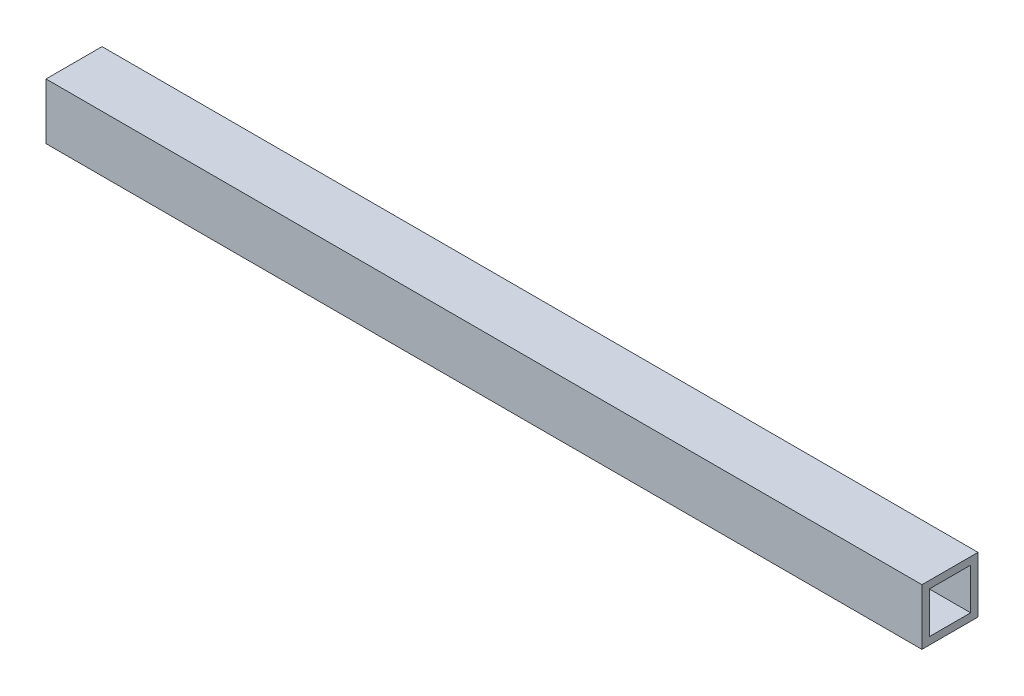
ISO-10303-21;
HEADER;
FILE_DESCRIPTION(('STEP AP214'),'2;1');
FILE_NAME('part.step','',(''),(''),'','','');
FILE_SCHEMA(('AUTOMOTIVE_DESIGN { 1 0 10303 214 1 1 1 1 }'));
ENDSEC;
DATA;
#1=APPLICATION_CONTEXT('core data for automotive mechanical design processes');
#2=APPLICATION_PROTOCOL_DEFINITION('international standard','automotive_design',2000,#1);
#3=PRODUCT_CONTEXT('',#1,'mechanical');
#4=PRODUCT('Part','Part','',(#3));
#5=PRODUCT_RELATED_PRODUCT_CATEGORY('part','',(#4));
#6=PRODUCT_DEFINITION_FORMATION('','',#4);
#7=PRODUCT_DEFINITION_CONTEXT('part definition',#1,'design');
#8=PRODUCT_DEFINITION('design','',#6,#7);
#9=PRODUCT_DEFINITION_SHAPE('','',#8);
#10=(LENGTH_UNIT() NAMED_UNIT(*) SI_UNIT(.MILLI.,.METRE.));
#11=(NAMED_UNIT(*) PLANE_ANGLE_UNIT() SI_UNIT($,.RADIAN.));
#12=(NAMED_UNIT(*) SI_UNIT($,.STERADIAN.) SOLID_ANGLE_UNIT());
#13=UNCERTAINTY_MEASURE_WITH_UNIT(LENGTH_MEASURE(1.E-05),#10,'distance_accuracy_value','');
#14=(GEOMETRIC_REPRESENTATION_CONTEXT(3) GLOBAL_UNCERTAINTY_ASSIGNED_CONTEXT((#13)) GLOBAL_UNIT_ASSIGNED_CONTEXT((#10,
#11,#12)) REPRESENTATION_CONTEXT('',''));
#15=CARTESIAN_POINT('',(0.,0.,0.));
#16=DIRECTION('',(0.,0.,1.));
#17=DIRECTION('',(1.,0.,0.));
#18=AXIS2_PLACEMENT_3D('',#15,#16,#17);
#19=CARTESIAN_POINT('',(594.,0.,0.));
#20=DIRECTION('',(-1.,0.,0.));
#21=DIRECTION('',(0.,0.,1.));
#22=AXIS2_PLACEMENT_3D('',#19,#20,#21);
#23=PLANE('',#22);
#24=DIRECTION('',(0.,-1.,0.));
#25=VECTOR('',#24,1.);
#26=CARTESIAN_POINT('',(594.,0.,0.));
#27=LINE('',#26,#25);
#28=CARTESIAN_POINT('',(594.,38.,0.));
#29=VERTEX_POINT('',#28);
#30=CARTESIAN_POINT('',(594.,0.,0.));
#31=VERTEX_POINT('',#30);
#32=EDGE_CURVE('E134',#29,#31,#27,.T.);
#33=ORIENTED_EDGE('',*,*,#32,.T.);
#34=DIRECTION('',(0.,0.,-1.));
#35=VECTOR('',#34,1.);
#36=CARTESIAN_POINT('',(594.,0.,0.));
#37=LINE('',#36,#35);
#38=CARTESIAN_POINT('',(594.,0.,-38.));
#39=VERTEX_POINT('',#38);
#40=EDGE_CURVE('E137',#31,#39,#37,.T.);
#41=ORIENTED_EDGE('',*,*,#40,.T.);
#42=DIRECTION('',(0.,1.,0.));
#43=VECTOR('',#42,1.);
#44=CARTESIAN_POINT('',(594.,0.,-38.));
#45=LINE('',#44,#43);
#46=CARTESIAN_POINT('',(594.,38.,-38.));
#47=VERTEX_POINT('',#46);
#48=EDGE_CURVE('E140',#39,#47,#45,.T.);
#49=ORIENTED_EDGE('',*,*,#48,.T.);
#50=DIRECTION('',(0.,0.,1.));
#51=VECTOR('',#50,1.);
#52=CARTESIAN_POINT('',(594.,38.,0.));
#53=LINE('',#52,#51);
#54=EDGE_CURVE('E142',#47,#29,#53,.T.);
#55=ORIENTED_EDGE('',*,*,#54,.T.);
#56=EDGE_LOOP('',(#33,#41,#49,#55));
#57=FACE_BOUND('',#56,.T.);
#58=DIRECTION('',(0.,0.,-1.));
#59=VECTOR('',#58,1.);
#60=CARTESIAN_POINT('',(594.,5.,-5.));
#61=LINE('',#60,#59);
#62=CARTESIAN_POINT('',(594.,5.,-5.));
#63=VERTEX_POINT('',#62);
#64=CARTESIAN_POINT('',(594.,5.,-33.));
#65=VERTEX_POINT('',#64);
#66=EDGE_CURVE('E98',#63,#65,#61,.T.);
#67=ORIENTED_EDGE('',*,*,#66,.F.);
#68=DIRECTION('',(0.,-1.,0.));
#69=VECTOR('',#68,1.);
#70=CARTESIAN_POINT('',(594.,5.,-5.));
#71=LINE('',#70,#69);
#72=CARTESIAN_POINT('',(594.,33.,-5.));
#73=VERTEX_POINT('',#72);
#74=EDGE_CURVE('E120',#73,#63,#71,.T.);
#75=ORIENTED_EDGE('',*,*,#74,.F.);
#76=DIRECTION('',(0.,0.,1.));
#77=VECTOR('',#76,1.);
#78=CARTESIAN_POINT('',(594.,33.,-5.));
#79=LINE('',#78,#77);
#80=CARTESIAN_POINT('',(594.,33.,-33.));
#81=VERTEX_POINT('',#80);
#82=EDGE_CURVE('E118',#81,#73,#79,.T.);
#83=ORIENTED_EDGE('',*,*,#82,.F.);
#84=DIRECTION('',(0.,1.,0.));
#85=VECTOR('',#84,1.);
#86=CARTESIAN_POINT('',(594.,5.,-33.));
#87=LINE('',#86,#85);
#88=EDGE_CURVE('E106',#65,#81,#87,.T.);
#89=ORIENTED_EDGE('',*,*,#88,.F.);
#90=EDGE_LOOP('',(#67,#75,#83,#89));
#91=FACE_BOUND('',#90,.T.);
#92=ADVANCED_FACE('F33',(#57,#91),#23,.F.);
#93=CARTESIAN_POINT('',(0.,0.,0.));
#94=DIRECTION('',(-1.,0.,0.));
#95=DIRECTION('',(0.,0.,1.));
#96=AXIS2_PLACEMENT_3D('',#93,#94,#95);
#97=PLANE('',#96);
#98=DIRECTION('',(0.,-1.,0.));
#99=VECTOR('',#98,1.);
#100=CARTESIAN_POINT('',(0.,0.,0.));
#101=LINE('',#100,#99);
#102=CARTESIAN_POINT('',(0.,38.,0.));
#103=VERTEX_POINT('',#102);
#104=CARTESIAN_POINT('',(0.,0.,0.));
#105=VERTEX_POINT('',#104);
#106=EDGE_CURVE('E114',#103,#105,#101,.T.);
#107=ORIENTED_EDGE('',*,*,#106,.F.);
#108=DIRECTION('',(0.,0.,1.));
#109=VECTOR('',#108,1.);
#110=CARTESIAN_POINT('',(0.,38.,0.));
#111=LINE('',#110,#109);
#112=CARTESIAN_POINT('',(0.,38.,-38.));
#113=VERTEX_POINT('',#112);
#114=EDGE_CURVE('E138',#113,#103,#111,.T.);
#115=ORIENTED_EDGE('',*,*,#114,.F.);
#116=DIRECTION('',(0.,1.,0.));
#117=VECTOR('',#116,1.);
#118=CARTESIAN_POINT('',(0.,0.,-38.));
#119=LINE('',#118,#117);
#120=CARTESIAN_POINT('',(0.,0.,-38.));
#121=VERTEX_POINT('',#120);
#122=EDGE_CURVE('E149',#121,#113,#119,.T.);
#123=ORIENTED_EDGE('',*,*,#122,.F.);
#124=DIRECTION('',(0.,0.,-1.));
#125=VECTOR('',#124,1.);
#126=CARTESIAN_POINT('',(0.,0.,0.));
#127=LINE('',#126,#125);
#128=EDGE_CURVE('E147',#105,#121,#127,.T.);
#129=ORIENTED_EDGE('',*,*,#128,.F.);
#130=EDGE_LOOP('',(#107,#115,#123,#129));
#131=FACE_BOUND('',#130,.T.);
#132=DIRECTION('',(0.,-1.,0.));
#133=VECTOR('',#132,1.);
#134=CARTESIAN_POINT('',(0.,5.,-5.));
#135=LINE('',#134,#133);
#136=CARTESIAN_POINT('',(0.,33.,-5.));
#137=VERTEX_POINT('',#136);
#138=CARTESIAN_POINT('',(0.,5.,-5.));
#139=VERTEX_POINT('',#138);
#140=EDGE_CURVE('E107',#137,#139,#135,.T.);
#141=ORIENTED_EDGE('',*,*,#140,.T.);
#142=DIRECTION('',(0.,0.,-1.));
#143=VECTOR('',#142,1.);
#144=CARTESIAN_POINT('',(0.,5.,-5.));
#145=LINE('',#144,#143);
#146=CARTESIAN_POINT('',(0.,5.,-33.));
#147=VERTEX_POINT('',#146);
#148=EDGE_CURVE('E56',#139,#147,#145,.T.);
#149=ORIENTED_EDGE('',*,*,#148,.T.);
#150=DIRECTION('',(0.,1.,0.));
#151=VECTOR('',#150,1.);
#152=CARTESIAN_POINT('',(0.,5.,-33.));
#153=LINE('',#152,#151);
#154=CARTESIAN_POINT('',(0.,33.,-33.));
#155=VERTEX_POINT('',#154);
#156=EDGE_CURVE('E113',#147,#155,#153,.T.);
#157=ORIENTED_EDGE('',*,*,#156,.T.);
#158=DIRECTION('',(0.,0.,1.));
#159=VECTOR('',#158,1.);
#160=CARTESIAN_POINT('',(0.,33.,-5.));
#161=LINE('',#160,#159);
#162=EDGE_CURVE('E126',#155,#137,#161,.T.);
#163=ORIENTED_EDGE('',*,*,#162,.T.);
#164=EDGE_LOOP('',(#141,#149,#157,#163));
#165=FACE_BOUND('',#164,.T.);
#166=ADVANCED_FACE('F167',(#131,#165),#97,.T.);
#167=CARTESIAN_POINT('',(594.,0.,0.));
#168=DIRECTION('',(0.,0.,-1.));
#169=DIRECTION('',(-1.,0.,0.));
#170=AXIS2_PLACEMENT_3D('',#167,#168,#169);
#171=PLANE('',#170);
#172=ORIENTED_EDGE('',*,*,#106,.T.);
#173=DIRECTION('',(-1.,0.,0.));
#174=VECTOR('',#173,1.);
#175=CARTESIAN_POINT('',(594.,0.,0.));
#176=LINE('',#175,#174);
#177=EDGE_CURVE('E11',#31,#105,#176,.T.);
#178=ORIENTED_EDGE('',*,*,#177,.F.);
#179=ORIENTED_EDGE('',*,*,#32,.F.);
#180=DIRECTION('',(-1.,0.,0.));
#181=VECTOR('',#180,1.);
#182=CARTESIAN_POINT('',(594.,38.,0.));
#183=LINE('',#182,#181);
#184=EDGE_CURVE('E144',#29,#103,#183,.T.);
#185=ORIENTED_EDGE('',*,*,#184,.T.);
#186=EDGE_LOOP('',(#172,#178,#179,#185));
#187=FACE_BOUND('',#186,.T.);
#188=ADVANCED_FACE('F35',(#187),#171,.F.);
#189=CARTESIAN_POINT('',(594.,0.,0.));
#190=DIRECTION('',(0.,1.,0.));
#191=DIRECTION('',(0.,0.,1.));
#192=AXIS2_PLACEMENT_3D('',#189,#190,#191);
#193=PLANE('',#192);
#194=ORIENTED_EDGE('',*,*,#128,.T.);
#195=DIRECTION('',(-1.,0.,0.));
#196=VECTOR('',#195,1.);
#197=CARTESIAN_POINT('',(594.,0.,-38.));
#198=LINE('',#197,#196);
#199=EDGE_CURVE('E41',#39,#121,#198,.T.);
#200=ORIENTED_EDGE('',*,*,#199,.F.);
#201=ORIENTED_EDGE('',*,*,#40,.F.);
#202=ORIENTED_EDGE('',*,*,#177,.T.);
#203=EDGE_LOOP('',(#194,#200,#201,#202));
#204=FACE_BOUND('',#203,.T.);
#205=ADVANCED_FACE('F177',(#204),#193,.F.);
#206=CARTESIAN_POINT('',(594.,0.,-38.));
#207=DIRECTION('',(0.,0.,1.));
#208=DIRECTION('',(1.,0.,0.));
#209=AXIS2_PLACEMENT_3D('',#206,#207,#208);
#210=PLANE('',#209);
#211=ORIENTED_EDGE('',*,*,#122,.T.);
#212=DIRECTION('',(-1.,0.,0.));
#213=VECTOR('',#212,1.);
#214=CARTESIAN_POINT('',(594.,38.,-38.));
#215=LINE('',#214,#213);
#216=EDGE_CURVE('E154',#47,#113,#215,.T.);
#217=ORIENTED_EDGE('',*,*,#216,.F.);
#218=ORIENTED_EDGE('',*,*,#48,.F.);
#219=ORIENTED_EDGE('',*,*,#199,.T.);
#220=EDGE_LOOP('',(#211,#217,#218,#219));
#221=FACE_BOUND('',#220,.T.);
#222=ADVANCED_FACE('F161',(#221),#210,.F.);
#223=CARTESIAN_POINT('',(594.,38.,0.));
#224=DIRECTION('',(0.,-1.,0.));
#225=DIRECTION('',(0.,0.,-1.));
#226=AXIS2_PLACEMENT_3D('',#223,#224,#225);
#227=PLANE('',#226);
#228=ORIENTED_EDGE('',*,*,#114,.T.);
#229=ORIENTED_EDGE('',*,*,#184,.F.);
#230=ORIENTED_EDGE('',*,*,#54,.F.);
#231=ORIENTED_EDGE('',*,*,#216,.T.);
#232=EDGE_LOOP('',(#228,#229,#230,#231));
#233=FACE_BOUND('',#232,.T.);
#234=ADVANCED_FACE('F171',(#233),#227,.F.);
#235=CARTESIAN_POINT('',(594.,5.,-5.));
#236=DIRECTION('',(0.,1.,0.));
#237=DIRECTION('',(0.,0.,1.));
#238=AXIS2_PLACEMENT_3D('',#235,#236,#237);
#239=PLANE('',#238);
#240=ORIENTED_EDGE('',*,*,#148,.F.);
#241=DIRECTION('',(-1.,0.,0.));
#242=VECTOR('',#241,1.);
#243=CARTESIAN_POINT('',(594.,5.,-5.));
#244=LINE('',#243,#242);
#245=EDGE_CURVE('E102',#63,#139,#244,.T.);
#246=ORIENTED_EDGE('',*,*,#245,.F.);
#247=ORIENTED_EDGE('',*,*,#66,.T.);
#248=DIRECTION('',(-1.,0.,0.));
#249=VECTOR('',#248,1.);
#250=CARTESIAN_POINT('',(594.,5.,-33.));
#251=LINE('',#250,#249);
#252=EDGE_CURVE('E101',#65,#147,#251,.T.);
#253=ORIENTED_EDGE('',*,*,#252,.T.);
#254=EDGE_LOOP('',(#240,#246,#247,#253));
#255=FACE_BOUND('',#254,.T.);
#256=ADVANCED_FACE('F100',(#255),#239,.T.);
#257=CARTESIAN_POINT('',(594.,5.,-33.));
#258=DIRECTION('',(0.,0.,1.));
#259=DIRECTION('',(1.,0.,0.));
#260=AXIS2_PLACEMENT_3D('',#257,#258,#259);
#261=PLANE('',#260);
#262=ORIENTED_EDGE('',*,*,#156,.F.);
#263=ORIENTED_EDGE('',*,*,#252,.F.);
#264=ORIENTED_EDGE('',*,*,#88,.T.);
#265=DIRECTION('',(-1.,0.,0.));
#266=VECTOR('',#265,1.);
#267=CARTESIAN_POINT('',(594.,33.,-33.));
#268=LINE('',#267,#266);
#269=EDGE_CURVE('E115',#81,#155,#268,.T.);
#270=ORIENTED_EDGE('',*,*,#269,.T.);
#271=EDGE_LOOP('',(#262,#263,#264,#270));
#272=FACE_BOUND('',#271,.T.);
#273=ADVANCED_FACE('F110',(#272),#261,.T.);
#274=CARTESIAN_POINT('',(594.,33.,-5.));
#275=DIRECTION('',(0.,-1.,0.));
#276=DIRECTION('',(0.,0.,-1.));
#277=AXIS2_PLACEMENT_3D('',#274,#275,#276);
#278=PLANE('',#277);
#279=ORIENTED_EDGE('',*,*,#162,.F.);
#280=ORIENTED_EDGE('',*,*,#269,.F.);
#281=ORIENTED_EDGE('',*,*,#82,.T.);
#282=DIRECTION('',(-1.,0.,0.));
#283=VECTOR('',#282,1.);
#284=CARTESIAN_POINT('',(594.,33.,-5.));
#285=LINE('',#284,#283);
#286=EDGE_CURVE('E48',#73,#137,#285,.T.);
#287=ORIENTED_EDGE('',*,*,#286,.T.);
#288=EDGE_LOOP('',(#279,#280,#281,#287));
#289=FACE_BOUND('',#288,.T.);
#290=ADVANCED_FACE('F200',(#289),#278,.T.);
#291=CARTESIAN_POINT('',(594.,5.,-5.));
#292=DIRECTION('',(0.,0.,-1.));
#293=DIRECTION('',(-1.,0.,0.));
#294=AXIS2_PLACEMENT_3D('',#291,#292,#293);
#295=PLANE('',#294);
#296=ORIENTED_EDGE('',*,*,#140,.F.);
#297=ORIENTED_EDGE('',*,*,#286,.F.);
#298=ORIENTED_EDGE('',*,*,#74,.T.);
#299=ORIENTED_EDGE('',*,*,#245,.T.);
#300=EDGE_LOOP('',(#296,#297,#298,#299));
#301=FACE_BOUND('',#300,.T.);
#302=ADVANCED_FACE('F204',(#301),#295,.T.);
#303=CLOSED_SHELL('',(#92,#166,#188,#205,#222,#234,#256,#273,#290,#302));
#304=MANIFOLD_SOLID_BREP('B2',#303);
#305=ADVANCED_BREP_SHAPE_REPRESENTATION('',(#18,#304),#14);
#306=SHAPE_DEFINITION_REPRESENTATION(#9,#305);
ENDSEC;
END-ISO-10303-21;
